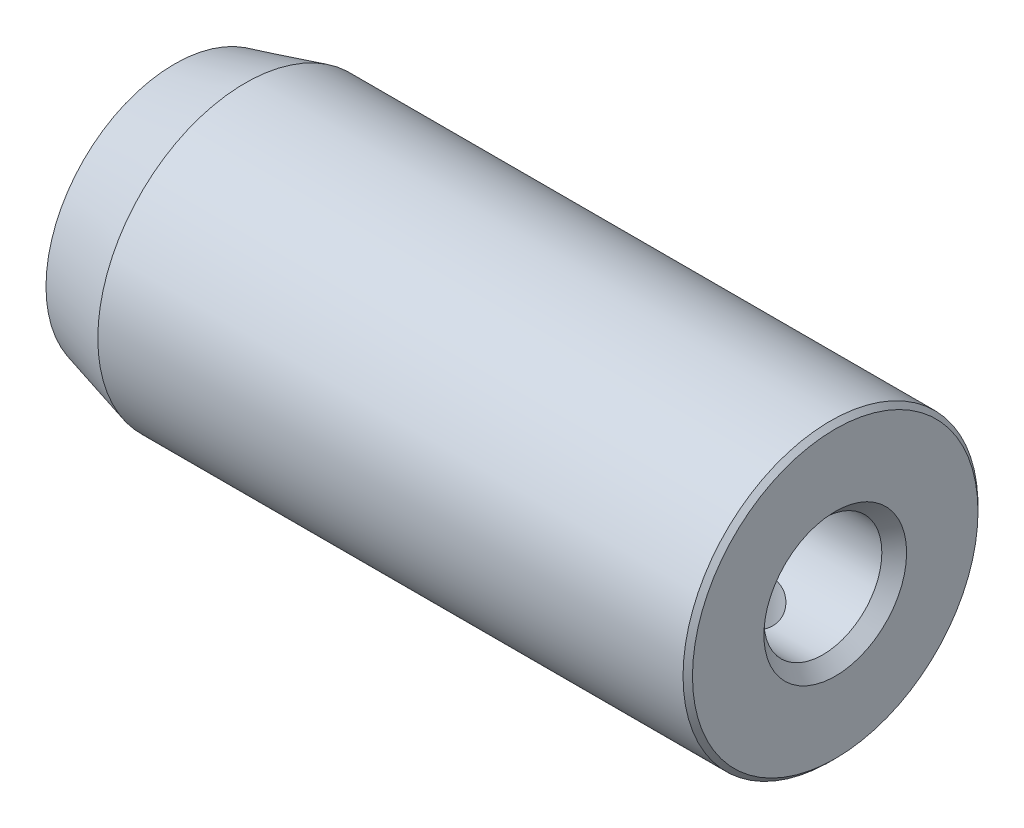
ISO-10303-21;
HEADER;
FILE_DESCRIPTION(('STEP AP214'),'2;1');
FILE_NAME('part.step','',(''),(''),'','','');
FILE_SCHEMA(('AUTOMOTIVE_DESIGN { 1 0 10303 214 1 1 1 1 }'));
ENDSEC;
DATA;
#1=APPLICATION_CONTEXT('core data for automotive mechanical design processes');
#2=APPLICATION_PROTOCOL_DEFINITION('international standard','automotive_design',2000,#1);
#3=PRODUCT_CONTEXT('',#1,'mechanical');
#4=PRODUCT('Part','Part','',(#3));
#5=PRODUCT_RELATED_PRODUCT_CATEGORY('part','',(#4));
#6=PRODUCT_DEFINITION_FORMATION('','',#4);
#7=PRODUCT_DEFINITION_CONTEXT('part definition',#1,'design');
#8=PRODUCT_DEFINITION('design','',#6,#7);
#9=PRODUCT_DEFINITION_SHAPE('','',#8);
#10=(LENGTH_UNIT() NAMED_UNIT(*) SI_UNIT(.MILLI.,.METRE.));
#11=(NAMED_UNIT(*) PLANE_ANGLE_UNIT() SI_UNIT($,.RADIAN.));
#12=(NAMED_UNIT(*) SI_UNIT($,.STERADIAN.) SOLID_ANGLE_UNIT());
#13=UNCERTAINTY_MEASURE_WITH_UNIT(LENGTH_MEASURE(1.E-05),#10,'distance_accuracy_value','');
#14=(GEOMETRIC_REPRESENTATION_CONTEXT(3) GLOBAL_UNCERTAINTY_ASSIGNED_CONTEXT((#13)) GLOBAL_UNIT_ASSIGNED_CONTEXT((#10,
#11,#12)) REPRESENTATION_CONTEXT('',''));
#15=CARTESIAN_POINT('',(0.,0.,0.));
#16=DIRECTION('',(0.,0.,1.));
#17=DIRECTION('',(1.,0.,0.));
#18=AXIS2_PLACEMENT_3D('',#15,#16,#17);
#19=CARTESIAN_POINT('',(-0.0589409946250355,0.,-5.));
#20=DIRECTION('',(1.,0.,0.));
#21=DIRECTION('',(0.,0.,-1.));
#22=AXIS2_PLACEMENT_3D('',#19,#20,#21);
#23=PLANE('',#22);
#24=CARTESIAN_POINT('',(-0.0589409946250355,0.,0.));
#25=DIRECTION('',(1.,0.,0.));
#26=DIRECTION('',(0.,0.,-1.));
#27=AXIS2_PLACEMENT_3D('',#24,#25,#26);
#28=CIRCLE('',#27,5.44615242270663);
#29=CARTESIAN_POINT('',(-0.0589409946250355,0.,-5.44615242270663));
#30=VERTEX_POINT('',#29);
#31=EDGE_CURVE('E43',#30,#30,#28,.F.);
#32=ORIENTED_EDGE('',*,*,#31,.T.);
#33=EDGE_LOOP('',(#32));
#34=FACE_BOUND('',#33,.T.);
#35=CARTESIAN_POINT('',(-0.0589409946250355,0.,0.));
#36=DIRECTION('',(-1.,0.,0.));
#37=DIRECTION('',(0.,0.,1.));
#38=AXIS2_PLACEMENT_3D('',#35,#36,#37);
#39=CIRCLE('',#38,5.);
#40=CARTESIAN_POINT('',(-0.0589409946250355,0.,5.));
#41=VERTEX_POINT('',#40);
#42=EDGE_CURVE('E59',#41,#41,#39,.T.);
#43=ORIENTED_EDGE('',*,*,#42,.F.);
#44=EDGE_LOOP('',(#43));
#45=FACE_BOUND('',#44,.T.);
#46=ADVANCED_FACE('F36',(#34,#45),#23,.F.);
#47=CARTESIAN_POINT('',(0.,0.,0.));
#48=DIRECTION('',(-1.,0.,0.));
#49=DIRECTION('',(0.,0.,1.));
#50=AXIS2_PLACEMENT_3D('',#47,#48,#49);
#51=CYLINDRICAL_SURFACE('',#50,6.25);
#52=CARTESIAN_POINT('',(23.941059005375,-6.10245852095694,1.35));
#53=CARTESIAN_POINT('',(23.8661841726596,-6.10246003360676,1.34999739370739));
#54=CARTESIAN_POINT('',(23.7912777933044,-6.10385155441619,1.34374966238566));
#55=CARTESIAN_POINT('',(23.643593551574,-6.10925736843426,1.3189501760943));
#56=CARTESIAN_POINT('',(23.5708172938034,-6.11327358825221,1.30038938280955));
#57=CARTESIAN_POINT('',(23.4295510132379,-6.12345320210466,1.25157407068251));
#58=CARTESIAN_POINT('',(23.3610564468237,-6.12961427283445,1.22133220092816));
#59=CARTESIAN_POINT('',(23.2301121349699,-6.14338660019173,1.15004916270664));
#60=CARTESIAN_POINT('',(23.1676622332281,-6.15099781930634,1.10900827358127));
#61=CARTESIAN_POINT('',(23.0495496817956,-6.16695296019077,1.01657138688502));
#62=CARTESIAN_POINT('',(22.9940011307749,-6.17530605693648,0.965031156844843));
#63=CARTESIAN_POINT('',(22.8922669026073,-6.1917233815881,0.853370027692093));
#64=CARTESIAN_POINT('',(22.8460819421168,-6.19978758734446,0.793248472394593));
#65=CARTESIAN_POINT('',(22.7639358731069,-6.21481828721504,0.665367747069246));
#66=CARTESIAN_POINT('',(22.7280843090412,-6.22177269410991,0.597536666697108));
#67=CARTESIAN_POINT('',(22.6683311650467,-6.23369667091998,0.456637369980628));
#68=CARTESIAN_POINT('',(22.6444282779491,-6.2386664579379,0.383569727509376));
#69=CARTESIAN_POINT('',(22.609609309557,-6.24599640116829,0.235457464822167));
#70=CARTESIAN_POINT('',(22.5985001855911,-6.24839530931683,0.160460176136341));
#71=CARTESIAN_POINT('',(22.5889807192387,-6.25044740242928,0.00963058695052952));
#72=CARTESIAN_POINT('',(22.5905689586279,-6.2501008940409,-0.0662016193489956));
#73=CARTESIAN_POINT('',(22.6062549619652,-6.24673087447189,-0.215218312053637));
#74=CARTESIAN_POINT('',(22.6201446713497,-6.24375188820421,-0.28842585385877));
#75=CARTESIAN_POINT('',(22.6597080277082,-6.23550228635704,-0.431445834459255));
#76=CARTESIAN_POINT('',(22.6853821987335,-6.23023156886553,-0.501258122116008));
#77=CARTESIAN_POINT('',(22.7479710223698,-6.21791885623649,-0.636085843411265));
#78=CARTESIAN_POINT('',(22.7849649368348,-6.21086443395242,-0.701063301309071));
#79=CARTESIAN_POINT('',(22.8690840912874,-6.19575845036736,-0.823964111254867));
#80=CARTESIAN_POINT('',(22.9162106794526,-6.18770675643739,-0.881886523003324));
#81=CARTESIAN_POINT('',(23.020391452501,-6.17129932047488,-0.990270045423081));
#82=CARTESIAN_POINT('',(23.0776277310778,-6.16294072424247,-1.04055584217847));
#83=CARTESIAN_POINT('',(23.1998069443415,-6.14701494625814,-1.13084725105703));
#84=CARTESIAN_POINT('',(23.2647500775372,-6.13944778490101,-1.17085259829811));
#85=CARTESIAN_POINT('',(23.4007781539199,-6.12595439746883,-1.23952275602368));
#86=CARTESIAN_POINT('',(23.4718799575969,-6.12003287563847,-1.26815515381097));
#87=CARTESIAN_POINT('',(23.6180438631804,-6.11056693169689,-1.3130128697812));
#88=CARTESIAN_POINT('',(23.6931053521273,-6.10702214282513,-1.32924010229525));
#89=CARTESIAN_POINT('',(23.8434579461384,-6.1027856262626,-1.34855642471345));
#90=CARTESIAN_POINT('',(23.9187147746318,-6.10203854150952,-1.3519004680301));
#91=CARTESIAN_POINT('',(24.0687106325794,-6.10333280344135,-1.3460451119147));
#92=CARTESIAN_POINT('',(24.1434496963196,-6.10537396368256,-1.33684655117855));
#93=CARTESIAN_POINT('',(24.2894053737995,-6.11196251899723,-1.30638809621589));
#94=CARTESIAN_POINT('',(24.3606525920219,-6.1164808499516,-1.28526799152438));
#95=CARTESIAN_POINT('',(24.498597105323,-6.1274885365993,-1.23171704365219));
#96=CARTESIAN_POINT('',(24.5652939731225,-6.13397807707868,-1.19928514003324));
#97=CARTESIAN_POINT('',(24.6933496769264,-6.14831901109099,-1.12346719358339));
#98=CARTESIAN_POINT('',(24.7546131310033,-6.15618942069534,-1.07992372171401));
#99=CARTESIAN_POINT('',(24.8690569694428,-6.1723548437891,-0.983325249976502));
#100=CARTESIAN_POINT('',(24.9222363746645,-6.18064990855042,-0.930269099625024));
#101=CARTESIAN_POINT('',(25.0199886811839,-6.19691205205521,-0.814999007726963));
#102=CARTESIAN_POINT('',(25.0643879767303,-6.20487045248234,-0.752636413072476));
#103=CARTESIAN_POINT('',(25.1420797760709,-6.21940424366779,-0.621189731939521));
#104=CARTESIAN_POINT('',(25.1753727915201,-6.22597969813188,-0.552105955288564));
#105=CARTESIAN_POINT('',(25.229663484627,-6.23697005681166,-0.409602769662209));
#106=CARTESIAN_POINT('',(25.2507379261294,-6.24139842078975,-0.336213691154038));
#107=CARTESIAN_POINT('',(25.2802335387735,-6.24765376995027,-0.186830646298547));
#108=CARTESIAN_POINT('',(25.2886565013577,-6.24948112343244,-0.11083705030845));
#109=CARTESIAN_POINT('',(25.2925311872262,-6.25031795822683,0.0399482767997578));
#110=CARTESIAN_POINT('',(25.2882423764182,-6.24938380692274,0.114733146061133));
#111=CARTESIAN_POINT('',(25.2673945029746,-6.24492302223593,0.26248941293784));
#112=CARTESIAN_POINT('',(25.2508356503596,-6.24139643322674,0.335460841570871));
#113=CARTESIAN_POINT('',(25.2060407639701,-6.23215080922831,0.477324006103824));
#114=CARTESIAN_POINT('',(25.1778406896506,-6.2264385297226,0.546227564864853));
#115=CARTESIAN_POINT('',(25.1105992475702,-6.21343225803372,0.678360033656794));
#116=CARTESIAN_POINT('',(25.0715568558064,-6.20613811646582,0.741588406948025));
#117=CARTESIAN_POINT('',(24.9828885923215,-6.19059556744477,0.861843970909895));
#118=CARTESIAN_POINT('',(24.9330797705325,-6.18233196371937,0.918734315430999));
#119=CARTESIAN_POINT('',(24.8246626254634,-6.16586494261428,1.02343796472107));
#120=CARTESIAN_POINT('',(24.7660521906001,-6.15766154017409,1.07124908505545));
#121=CARTESIAN_POINT('',(24.6407818315589,-6.14212538486053,1.15703322534854));
#122=CARTESIAN_POINT('',(24.5740273840428,-6.13480530113677,1.19487063461721));
#123=CARTESIAN_POINT('',(24.434964109274,-6.12202315717448,1.25873001918001));
#124=CARTESIAN_POINT('',(24.3626600966136,-6.11655950820825,1.28476210383107));
#125=CARTESIAN_POINT('',(24.2320667033321,-6.10913124830852,1.31956342465189));
#126=CARTESIAN_POINT('',(24.1744915390421,-6.10664541432531,1.33095547726748));
#127=CARTESIAN_POINT('',(24.0583036675426,-6.10330849628974,1.3461746100374));
#128=CARTESIAN_POINT('',(23.9996910085603,-6.10245733645094,1.35000204090148));
#129=CARTESIAN_POINT('',(23.941059005375,-6.10245852095694,1.35));
#130=B_SPLINE_CURVE_WITH_KNOTS('',3,(#52,#53,#54,#55,#56,#57,#58,#59,#60,#61,#62,#63,#64,#65,
#66,#67,#68,#69,#70,#71,#72,#73,#74,#75,#76,#77,#78,#79,#80,#81,#82,#83,#84,#85,#86,#87,#88,#89,
#90,#91,#92,#93,#94,#95,#96,#97,#98,#99,#100,#101,#102,#103,#104,#105,#106,#107,#108,#109,#110,
#111,#112,#113,#114,#115,#116,#117,#118,#119,#120,#121,#122,#123,#124,#125,#126,#127,#128,#129),
.UNSPECIFIED.,.T.,.F.,(4,2,2,2,2,2,2,2,2,2,2,2,2,2,2,2,2,2,2,2,2,2,2,2,2,2,2,2,2,2,2,2,2,2,2,2,
2,2,4),(0.,0.224409647581693,0.448984204000981,0.673316254062232,0.897642501822714,
1.12528795492247,1.3529508246352,1.58294515302156,1.81291431483524,2.03936607491754,
2.26579254195794,2.48846107223554,2.71113950547248,2.93541428668969,3.15971892671186,
3.38857649964417,3.61743996864145,3.84695109314732,4.07642679297187,4.30133720264794,
4.52623257380505,4.74854407273092,4.97087641812096,5.1965529747136,5.42225684353757,
5.65205465012204,5.88184186869113,6.11016934022076,6.33846447765741,6.56213207891262,
6.78579585184497,7.00877384205555,7.2317728985917,7.45891007919399,7.68610183928513,
7.91623961406363,8.14617993907019,8.32191585389154,8.49764362108218),.UNSPECIFIED.);
#131=CARTESIAN_POINT('',(23.941059005375,-6.10245852095694,1.35));
#132=VERTEX_POINT('',#131);
#133=EDGE_CURVE('E71',#132,#132,#130,.T.);
#134=ORIENTED_EDGE('',*,*,#133,.F.);
#135=EDGE_LOOP('',(#134));
#136=FACE_BOUND('',#135,.T.);
#137=CARTESIAN_POINT('',(2.941059005375,0.,0.));
#138=DIRECTION('',(1.,0.,0.));
#139=DIRECTION('',(0.,0.,-1.));
#140=AXIS2_PLACEMENT_3D('',#137,#138,#139);
#141=CIRCLE('',#140,6.25);
#142=CARTESIAN_POINT('',(2.941059005375,0.,-6.25));
#143=VERTEX_POINT('',#142);
#144=EDGE_CURVE('E10',#143,#143,#141,.T.);
#145=ORIENTED_EDGE('',*,*,#144,.T.);
#146=EDGE_LOOP('',(#145));
#147=FACE_BOUND('',#146,.T.);
#148=CARTESIAN_POINT('',(27.741059005375,0.,0.));
#149=DIRECTION('',(-1.,0.,0.));
#150=DIRECTION('',(0.,0.,1.));
#151=AXIS2_PLACEMENT_3D('',#148,#149,#150);
#152=CIRCLE('',#151,6.25);
#153=CARTESIAN_POINT('',(27.741059005375,0.,6.25));
#154=VERTEX_POINT('',#153);
#155=EDGE_CURVE('E51',#154,#154,#152,.T.);
#156=ORIENTED_EDGE('',*,*,#155,.T.);
#157=EDGE_LOOP('',(#156));
#158=FACE_BOUND('',#157,.T.);
#159=ADVANCED_FACE('F112',(#136,#147,#158),#51,.T.);
#160=CARTESIAN_POINT('',(27.941059005375,0.,-6.25));
#161=DIRECTION('',(-1.,0.,0.));
#162=DIRECTION('',(0.,0.,1.));
#163=AXIS2_PLACEMENT_3D('',#160,#161,#162);
#164=PLANE('',#163);
#165=CARTESIAN_POINT('',(27.941059005375,0.,0.));
#166=DIRECTION('',(-1.,0.,0.));
#167=DIRECTION('',(0.,0.,1.));
#168=AXIS2_PLACEMENT_3D('',#165,#166,#167);
#169=CIRCLE('',#168,6.04999999999999);
#170=CARTESIAN_POINT('',(27.941059005375,0.,6.04999999999999));
#171=VERTEX_POINT('',#170);
#172=EDGE_CURVE('E47',#171,#171,#169,.F.);
#173=ORIENTED_EDGE('',*,*,#172,.T.);
#174=EDGE_LOOP('',(#173));
#175=FACE_BOUND('',#174,.T.);
#176=CARTESIAN_POINT('',(27.941059005375,0.,0.));
#177=DIRECTION('',(1.,0.,0.));
#178=DIRECTION('',(0.,0.,-1.));
#179=AXIS2_PLACEMENT_3D('',#176,#177,#178);
#180=CIRCLE('',#179,3.025);
#181=CARTESIAN_POINT('',(27.941059005375,0.,-3.025));
#182=VERTEX_POINT('',#181);
#183=EDGE_CURVE('E68',#182,#182,#180,.T.);
#184=ORIENTED_EDGE('',*,*,#183,.F.);
#185=EDGE_LOOP('',(#184));
#186=FACE_BOUND('',#185,.T.);
#187=ADVANCED_FACE('F108',(#175,#186),#164,.F.);
#188=CARTESIAN_POINT('',(19.941059005375,0.,0.));
#189=DIRECTION('',(1.,0.,0.));
#190=DIRECTION('',(0.,0.,-1.));
#191=AXIS2_PLACEMENT_3D('',#188,#189,#190);
#192=PLANE('',#191);
#193=CARTESIAN_POINT('',(19.941059005375,0.,0.));
#194=DIRECTION('',(1.,0.,0.));
#195=DIRECTION('',(0.,0.,-1.));
#196=AXIS2_PLACEMENT_3D('',#193,#194,#195);
#197=CIRCLE('',#196,2.5);
#198=CARTESIAN_POINT('',(19.941059005375,0.,-2.5));
#199=VERTEX_POINT('',#198);
#200=EDGE_CURVE('E62',#199,#199,#197,.T.);
#201=ORIENTED_EDGE('',*,*,#200,.T.);
#202=EDGE_LOOP('',(#201));
#203=FACE_BOUND('',#202,.T.);
#204=CARTESIAN_POINT('',(19.941059005375,0.,0.));
#205=DIRECTION('',(-1.,0.,0.));
#206=DIRECTION('',(0.,0.,1.));
#207=AXIS2_PLACEMENT_3D('',#204,#205,#206);
#208=CIRCLE('',#207,5.);
#209=CARTESIAN_POINT('',(19.941059005375,0.,5.));
#210=VERTEX_POINT('',#209);
#211=EDGE_CURVE('E56',#210,#210,#208,.T.);
#212=ORIENTED_EDGE('',*,*,#211,.T.);
#213=EDGE_LOOP('',(#212));
#214=FACE_BOUND('',#213,.T.);
#215=ADVANCED_FACE('F104',(#203,#214),#192,.F.);
#216=CARTESIAN_POINT('',(0.,0.,0.));
#217=DIRECTION('',(-1.,0.,0.));
#218=DIRECTION('',(0.,0.,1.));
#219=AXIS2_PLACEMENT_3D('',#216,#217,#218);
#220=CYLINDRICAL_SURFACE('',#219,5.);
#221=ORIENTED_EDGE('',*,*,#211,.F.);
#222=EDGE_LOOP('',(#221));
#223=FACE_BOUND('',#222,.T.);
#224=ORIENTED_EDGE('',*,*,#42,.T.);
#225=EDGE_LOOP('',(#224));
#226=FACE_BOUND('',#225,.T.);
#227=ADVANCED_FACE('F100',(#223,#226),#220,.F.);
#228=CARTESIAN_POINT('',(27.941059005375,0.,0.));
#229=DIRECTION('',(1.,0.,0.));
#230=DIRECTION('',(0.,0.,-1.));
#231=AXIS2_PLACEMENT_3D('',#228,#229,#230);
#232=CYLINDRICAL_SURFACE('',#231,2.5);
#233=CARTESIAN_POINT('',(23.941059005375,-2.10416254125008,1.35));
#234=CARTESIAN_POINT('',(24.010488431464,-2.1041697635088,1.34999470198538));
#235=CARTESIAN_POINT('',(24.0799843952376,-2.10765287467898,1.34460701095876));
#236=CARTESIAN_POINT('',(24.2167687635775,-2.12104931439274,1.32336558200872));
#237=CARTESIAN_POINT('',(24.2840530515137,-2.13097399134214,1.30749337214411));
#238=CARTESIAN_POINT('',(24.414165745225,-2.15575208442783,1.26621594431115));
#239=CARTESIAN_POINT('',(24.4770183801433,-2.1705756868872,1.24086827225263));
#240=CARTESIAN_POINT('',(24.5975575073629,-2.20343343562536,1.18153636262021));
#241=CARTESIAN_POINT('',(24.6552430596428,-2.22146816431234,1.14755055785257));
#242=CARTESIAN_POINT('',(24.7699819658764,-2.26084751005276,1.06804472621593));
#243=CARTESIAN_POINT('',(24.8264293889859,-2.28234346764209,1.02172488293171));
#244=CARTESIAN_POINT('',(24.9312377905396,-2.32500768955608,0.920520034363));
#245=CARTESIAN_POINT('',(24.9795941088776,-2.3461757587072,0.865630128052813));
#246=CARTESIAN_POINT('',(25.0707417470363,-2.38786672592889,0.743365381565978));
#247=CARTESIAN_POINT('',(25.1127530372846,-2.40819482756527,0.675336231077067));
#248=CARTESIAN_POINT('',(25.1844533532731,-2.44388224170316,0.531870518885401));
#249=CARTESIAN_POINT('',(25.2141514316149,-2.45924520270817,0.45643944966794));
#250=CARTESIAN_POINT('',(25.2578643611634,-2.48216834654587,0.306759455445969));
#251=CARTESIAN_POINT('',(25.2729519721096,-2.4902584223725,0.232906912490295));
#252=CARTESIAN_POINT('',(25.2905844073783,-2.49973200589333,0.0833138124884469));
#253=CARTESIAN_POINT('',(25.2931383265184,-2.5011203765311,0.00757466454163796));
#254=CARTESIAN_POINT('',(25.2859614583036,-2.49725031109435,-0.13542423879341));
#255=CARTESIAN_POINT('',(25.2774458100254,-2.4926492757188,-0.202767544873152));
#256=CARTESIAN_POINT('',(25.2505968917936,-2.47835841599082,-0.334896410901657));
#257=CARTESIAN_POINT('',(25.2322628727836,-2.46866820337947,-0.399681775296741));
#258=CARTESIAN_POINT('',(25.1862704642323,-2.44492545966878,-0.525844003643466));
#259=CARTESIAN_POINT('',(25.1585070280981,-2.43082393137887,-0.587172969311029));
#260=CARTESIAN_POINT('',(25.0946374986806,-2.39947282351857,-0.704428077199168));
#261=CARTESIAN_POINT('',(25.0585286557158,-2.38222220676714,-0.760352430052482));
#262=CARTESIAN_POINT('',(24.9746552874208,-2.34398878853111,-0.871506620939212));
#263=CARTESIAN_POINT('',(24.9260637887704,-2.32280426418771,-0.926043207466076));
#264=CARTESIAN_POINT('',(24.8207784334461,-2.28015091590952,-1.02659696090972));
#265=CARTESIAN_POINT('',(24.7640766717475,-2.2586818333617,-1.07260571415678));
#266=CARTESIAN_POINT('',(24.6385192880674,-2.21589430035681,-1.15857847104829));
#267=CARTESIAN_POINT('',(24.5690465704344,-2.19473483595264,-1.1977290301741));
#268=CARTESIAN_POINT('',(24.4231511695426,-2.15753778243648,-1.26351517396505));
#269=CARTESIAN_POINT('',(24.346736566379,-2.14149433417887,-1.29016509165936));
#270=CARTESIAN_POINT('',(24.1955385420565,-2.11829031383578,-1.32789465121203));
#271=CARTESIAN_POINT('',(24.1211255545722,-2.11051478714676,-1.34006189370809));
#272=CARTESIAN_POINT('',(23.9709405851027,-2.10304406117062,-1.35176310278424));
#273=CARTESIAN_POINT('',(23.8951700913891,-2.10334049641915,-1.35131014842943));
#274=CARTESIAN_POINT('',(23.7556142715963,-2.11132652693586,-1.3387804982216));
#275=CARTESIAN_POINT('',(23.6916145851655,-2.11799306041043,-1.32831204162578));
#276=CARTESIAN_POINT('',(23.5664466845891,-2.1363514032103,-1.29857836060268));
#277=CARTESIAN_POINT('',(23.5052796414968,-2.14804527071863,-1.27930953311505));
#278=CARTESIAN_POINT('',(23.3844285010133,-2.17571123170097,-1.23169238599551));
#279=CARTESIAN_POINT('',(23.3249248622044,-2.19184739949604,-1.20298534464637));
#280=CARTESIAN_POINT('',(23.2112234598485,-2.22648196784546,-1.13760552129313));
#281=CARTESIAN_POINT('',(23.1570283913445,-2.24498155738762,-1.10092872331759));
#282=CARTESIAN_POINT('',(23.0468704427746,-2.28562179666646,-1.0141782812784));
#283=CARTESIAN_POINT('',(22.9918855159423,-2.30788920789316,-0.962916538126927));
#284=CARTESIAN_POINT('',(22.8909239488495,-2.35121313776699,-0.851681307065707));
#285=CARTESIAN_POINT('',(22.8449520964361,-2.37226900865709,-0.791703218230826));
#286=CARTESIAN_POINT('',(22.7614259772778,-2.41197487547339,-0.661231348273919));
#287=CARTESIAN_POINT('',(22.7243441653453,-2.43047377345912,-0.590385584263057));
#288=CARTESIAN_POINT('',(22.6630172901434,-2.4617455879544,-0.44217906850795));
#289=CARTESIAN_POINT('',(22.6387592626487,-2.47452428529885,-0.364824988442133));
#290=CARTESIAN_POINT('',(22.6061512811656,-2.49184869227074,-0.214141473979632));
#291=CARTESIAN_POINT('',(22.5964519044135,-2.49709052765163,-0.141184354847521));
#292=CARTESIAN_POINT('',(22.5890775879253,-2.50106809730126,0.00549953792275092));
#293=CARTESIAN_POINT('',(22.5913968091127,-2.49980699093958,0.0792259204521564));
#294=CARTESIAN_POINT('',(22.607207380835,-2.49130964804118,0.218751293492751));
#295=CARTESIAN_POINT('',(22.6197396213882,-2.48458651472807,0.284694308461503));
#296=CARTESIAN_POINT('',(22.654184347361,-2.46644127361116,0.413391531342424));
#297=CARTESIAN_POINT('',(22.6760979922523,-2.45501858498405,0.476145344020045));
#298=CARTESIAN_POINT('',(22.7294430769166,-2.42795517182548,0.599295308594757));
#299=CARTESIAN_POINT('',(22.7611917788574,-2.41217610987966,0.659522627208168));
#300=CARTESIAN_POINT('',(22.832914881021,-2.37791741148884,0.774005908414892));
#301=CARTESIAN_POINT('',(22.8728927461123,-2.35943663844811,0.828259340900883));
#302=CARTESIAN_POINT('',(22.9650963031639,-2.31907201991108,0.935711619905162));
#303=CARTESIAN_POINT('',(23.0181931422158,-2.297039050313,0.988108281674234));
#304=CARTESIAN_POINT('',(23.1324779948228,-2.25355522749017,1.08362812337877));
#305=CARTESIAN_POINT('',(23.1936751872713,-2.2321050684133,1.12674063521288));
#306=CARTESIAN_POINT('',(23.3269257410357,-2.19098385228687,1.20484484037488));
#307=CARTESIAN_POINT('',(23.3994059722551,-2.17149170175541,1.23920956381131));
#308=CARTESIAN_POINT('',(23.5504772662056,-2.13885181758694,1.29474753871427));
#309=CARTESIAN_POINT('',(23.6290475709418,-2.12568354561321,1.31596355992243));
#310=CARTESIAN_POINT('',(23.747378270707,-2.11271377803864,1.33659781736555));
#311=CARTESIAN_POINT('',(23.7858651211808,-2.1095241544185,1.3416123031842));
#312=CARTESIAN_POINT('',(23.8632473428983,-2.1052464921877,1.34831491055871));
#313=CARTESIAN_POINT('',(23.9021427218032,-2.10415849306066,1.35000296962039));
#314=CARTESIAN_POINT('',(23.941059005375,-2.10416254125008,1.35));
#315=B_SPLINE_CURVE_WITH_KNOTS('',3,(#233,#234,#235,#236,#237,#238,#239,#240,#241,#242,#243,
#244,#245,#246,#247,#248,#249,#250,#251,#252,#253,#254,#255,#256,#257,#258,#259,#260,#261,#262,
#263,#264,#265,#266,#267,#268,#269,#270,#271,#272,#273,#274,#275,#276,#277,#278,#279,#280,#281,
#282,#283,#284,#285,#286,#287,#288,#289,#290,#291,#292,#293,#294,#295,#296,#297,#298,#299,#300,
#301,#302,#303,#304,#305,#306,#307,#308,#309,#310,#311,#312,#313,#314),.UNSPECIFIED.,.T.,.F.,(4,
2,2,2,2,2,2,2,2,2,2,2,2,2,2,2,2,2,2,2,2,2,2,2,2,2,2,2,2,2,2,2,2,2,2,2,2,2,2,2,4),(0.,
0.208123471458408,0.416614602626653,0.623859580305864,0.831142184769692,1.05856351034292,
1.28611537265738,1.53230205977356,1.77830742955094,2.00444815214455,2.23042475605106,
2.43356934632927,2.63672943698249,2.84223136875821,3.04780110698984,3.27501774804631,
3.50245738437738,3.7486875600553,3.99463471797441,4.22063264491107,4.44639636539419,
4.64109045710759,4.83586433230913,5.03911679776592,5.24247192091504,5.47666139428988,
5.71097493668479,5.95584323308154,6.20046350377908,6.42059528697129,6.64062013208215,
6.84208131882636,7.04356741186723,7.25238376212451,7.46128821448887,7.69364551940203,
7.92626841015047,8.17257670085129,8.4180795427968,8.5347338251234,8.65139029903456),.UNSPECIFIED.);
#316=CARTESIAN_POINT('',(23.941059005375,-2.10416254125008,1.35));
#317=VERTEX_POINT('',#316);
#318=EDGE_CURVE('E79',#317,#317,#315,.T.);
#319=ORIENTED_EDGE('',*,*,#318,.F.);
#320=EDGE_LOOP('',(#319));
#321=FACE_BOUND('',#320,.T.);
#322=ORIENTED_EDGE('',*,*,#200,.F.);
#323=EDGE_LOOP('',(#322));
#324=FACE_BOUND('',#323,.T.);
#325=CARTESIAN_POINT('',(27.416059005375,0.,0.));
#326=DIRECTION('',(1.,0.,0.));
#327=DIRECTION('',(0.,0.,-1.));
#328=AXIS2_PLACEMENT_3D('',#325,#326,#327);
#329=CIRCLE('',#328,2.5);
#330=CARTESIAN_POINT('',(27.416059005375,0.,-2.5));
#331=VERTEX_POINT('',#330);
#332=EDGE_CURVE('E65',#331,#331,#329,.T.);
#333=ORIENTED_EDGE('',*,*,#332,.T.);
#334=EDGE_LOOP('',(#333));
#335=FACE_BOUND('',#334,.T.);
#336=ADVANCED_FACE('F96',(#321,#324,#335),#232,.F.);
#337=CARTESIAN_POINT('',(27.941059005375,0.,0.));
#338=DIRECTION('',(1.,0.,0.));
#339=DIRECTION('',(0.,0.,-1.));
#340=AXIS2_PLACEMENT_3D('',#337,#338,#339);
#341=CONICAL_SURFACE('',#340,3.025,0.785398163397445);
#342=ORIENTED_EDGE('',*,*,#332,.F.);
#343=EDGE_LOOP('',(#342));
#344=FACE_BOUND('',#343,.T.);
#345=ORIENTED_EDGE('',*,*,#183,.T.);
#346=EDGE_LOOP('',(#345));
#347=FACE_BOUND('',#346,.T.);
#348=ADVANCED_FACE('F91',(#344,#347),#341,.F.);
#349=CARTESIAN_POINT('',(27.741059005375,0.,0.));
#350=DIRECTION('',(-1.,0.,0.));
#351=DIRECTION('',(0.,0.,1.));
#352=AXIS2_PLACEMENT_3D('',#349,#350,#351);
#353=CONICAL_SURFACE('',#352,6.25,0.785398163397453);
#354=ORIENTED_EDGE('',*,*,#172,.F.);
#355=EDGE_LOOP('',(#354));
#356=FACE_BOUND('',#355,.T.);
#357=ORIENTED_EDGE('',*,*,#155,.F.);
#358=EDGE_LOOP('',(#357));
#359=FACE_BOUND('',#358,.T.);
#360=ADVANCED_FACE('F95',(#356,#359),#353,.T.);
#361=CARTESIAN_POINT('',(-0.0589409946250355,0.,0.));
#362=DIRECTION('',(1.,0.,0.));
#363=DIRECTION('',(0.,0.,-1.));
#364=AXIS2_PLACEMENT_3D('',#361,#362,#363);
#365=CONICAL_SURFACE('',#364,5.44615242270663,0.261799387799147);
#366=ORIENTED_EDGE('',*,*,#144,.F.);
#367=EDGE_LOOP('',(#366));
#368=FACE_BOUND('',#367,.T.);
#369=ORIENTED_EDGE('',*,*,#31,.F.);
#370=EDGE_LOOP('',(#369));
#371=FACE_BOUND('',#370,.T.);
#372=ADVANCED_FACE('F38',(#368,#371),#365,.T.);
#373=CARTESIAN_POINT('',(23.941059005375,-6.251,0.));
#374=DIRECTION('',(0.,1.,0.));
#375=DIRECTION('',(0.,0.,1.));
#376=AXIS2_PLACEMENT_3D('',#373,#374,#375);
#377=CYLINDRICAL_SURFACE('',#376,1.35);
#378=ORIENTED_EDGE('',*,*,#318,.T.);
#379=EDGE_LOOP('',(#378));
#380=FACE_BOUND('',#379,.T.);
#381=ORIENTED_EDGE('',*,*,#133,.T.);
#382=EDGE_LOOP('',(#381));
#383=FACE_BOUND('',#382,.T.);
#384=ADVANCED_FACE('F84',(#380,#383),#377,.F.);
#385=CLOSED_SHELL('',(#46,#159,#187,#215,#227,#336,#348,#360,#372,#384));
#386=MANIFOLD_SOLID_BREP('B2',#385);
#387=ADVANCED_BREP_SHAPE_REPRESENTATION('',(#18,#386),#14);
#388=SHAPE_DEFINITION_REPRESENTATION(#9,#387);
ENDSEC;
END-ISO-10303-21;
